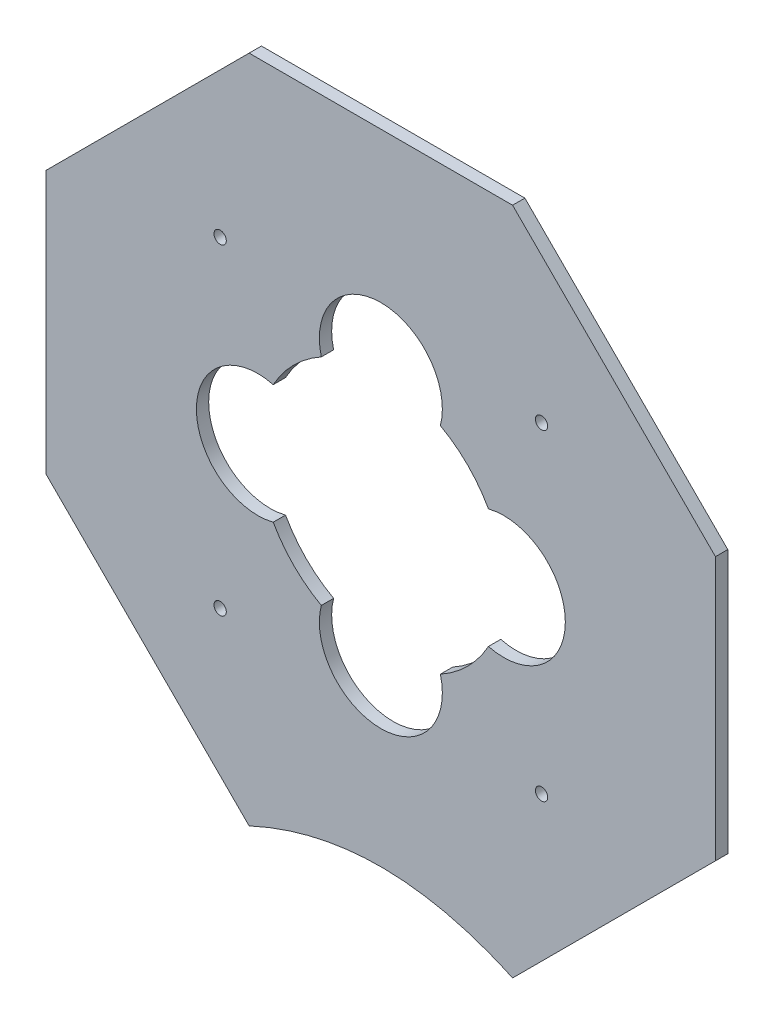
ISO-10303-21;
HEADER;
FILE_DESCRIPTION(('STEP AP214'),'2;1');
FILE_NAME('part.step','',(''),(''),'','','');
FILE_SCHEMA(('AUTOMOTIVE_DESIGN { 1 0 10303 214 1 1 1 1 }'));
ENDSEC;
DATA;
#1=APPLICATION_CONTEXT('core data for automotive mechanical design processes');
#2=APPLICATION_PROTOCOL_DEFINITION('international standard','automotive_design',2000,#1);
#3=PRODUCT_CONTEXT('',#1,'mechanical');
#4=PRODUCT('Part','Part','',(#3));
#5=PRODUCT_RELATED_PRODUCT_CATEGORY('part','',(#4));
#6=PRODUCT_DEFINITION_FORMATION('','',#4);
#7=PRODUCT_DEFINITION_CONTEXT('part definition',#1,'design');
#8=PRODUCT_DEFINITION('design','',#6,#7);
#9=PRODUCT_DEFINITION_SHAPE('','',#8);
#10=(LENGTH_UNIT() NAMED_UNIT(*) SI_UNIT(.MILLI.,.METRE.));
#11=(NAMED_UNIT(*) PLANE_ANGLE_UNIT() SI_UNIT($,.RADIAN.));
#12=(NAMED_UNIT(*) SI_UNIT($,.STERADIAN.) SOLID_ANGLE_UNIT());
#13=UNCERTAINTY_MEASURE_WITH_UNIT(LENGTH_MEASURE(1.E-05),#10,'distance_accuracy_value','');
#14=(GEOMETRIC_REPRESENTATION_CONTEXT(3) GLOBAL_UNCERTAINTY_ASSIGNED_CONTEXT((#13)) GLOBAL_UNIT_ASSIGNED_CONTEXT((#10,
#11,#12)) REPRESENTATION_CONTEXT('',''));
#15=CARTESIAN_POINT('',(0.,0.,0.));
#16=DIRECTION('',(0.,0.,1.));
#17=DIRECTION('',(1.,0.,0.));
#18=AXIS2_PLACEMENT_3D('',#15,#16,#17);
#19=CARTESIAN_POINT('',(-81.6309432949496,32.1334686118915,3.));
#20=DIRECTION('',(0.707106781186547,-0.707106781186547,0.));
#21=DIRECTION('',(0.707106781186548,0.707106781186548,0.));
#22=AXIS2_PLACEMENT_3D('',#19,#20,#21);
#23=PLANE('',#22);
#24=DIRECTION('',(-0.707106781186548,-0.707106781186548,0.));
#25=VECTOR('',#24,1.);
#26=CARTESIAN_POINT('',(-81.6309432949496,32.1334686118915,0.));
#27=LINE('',#26,#25);
#28=CARTESIAN_POINT('',(-32.1334686118913,81.6309432949497,0.));
#29=VERTEX_POINT('',#28);
#30=CARTESIAN_POINT('',(-81.6309432949496,32.1334686118915,0.));
#31=VERTEX_POINT('',#30);
#32=EDGE_CURVE('E229',#29,#31,#27,.T.);
#33=ORIENTED_EDGE('',*,*,#32,.T.);
#34=DIRECTION('',(0.,0.,-1.));
#35=VECTOR('',#34,1.);
#36=CARTESIAN_POINT('',(-81.6309432949496,32.1334686118915,3.));
#37=LINE('',#36,#35);
#38=CARTESIAN_POINT('',(-81.6309432949496,32.1334686118915,3.));
#39=VERTEX_POINT('',#38);
#40=EDGE_CURVE('E11',#39,#31,#37,.T.);
#41=ORIENTED_EDGE('',*,*,#40,.F.);
#42=DIRECTION('',(-0.707106781186548,-0.707106781186548,0.));
#43=VECTOR('',#42,1.);
#44=CARTESIAN_POINT('',(-81.6309432949496,32.1334686118915,3.));
#45=LINE('',#44,#43);
#46=CARTESIAN_POINT('',(-32.1334686118913,81.6309432949497,3.));
#47=VERTEX_POINT('',#46);
#48=EDGE_CURVE('E232',#47,#39,#45,.T.);
#49=ORIENTED_EDGE('',*,*,#48,.F.);
#50=DIRECTION('',(0.,0.,-1.));
#51=VECTOR('',#50,1.);
#52=CARTESIAN_POINT('',(-32.1334686118913,81.6309432949497,3.));
#53=LINE('',#52,#51);
#54=EDGE_CURVE('E301',#47,#29,#53,.T.);
#55=ORIENTED_EDGE('',*,*,#54,.T.);
#56=EDGE_LOOP('',(#33,#41,#49,#55));
#57=FACE_BOUND('',#56,.T.);
#58=ADVANCED_FACE('F37',(#57),#23,.F.);
#59=CARTESIAN_POINT('',(-81.6309432949497,-32.1334686118914,3.));
#60=DIRECTION('',(1.,0.,0.));
#61=DIRECTION('',(0.,1.,0.));
#62=AXIS2_PLACEMENT_3D('',#59,#60,#61);
#63=PLANE('',#62);
#64=DIRECTION('',(0.,-1.,0.));
#65=VECTOR('',#64,1.);
#66=CARTESIAN_POINT('',(-81.6309432949497,-32.1334686118914,0.));
#67=LINE('',#66,#65);
#68=CARTESIAN_POINT('',(-81.6309432949497,-32.1334686118914,0.));
#69=VERTEX_POINT('',#68);
#70=EDGE_CURVE('E269',#31,#69,#67,.T.);
#71=ORIENTED_EDGE('',*,*,#70,.T.);
#72=DIRECTION('',(0.,0.,-1.));
#73=VECTOR('',#72,1.);
#74=CARTESIAN_POINT('',(-81.6309432949497,-32.1334686118914,3.));
#75=LINE('',#74,#73);
#76=CARTESIAN_POINT('',(-81.6309432949497,-32.1334686118914,3.));
#77=VERTEX_POINT('',#76);
#78=EDGE_CURVE('E44',#77,#69,#75,.T.);
#79=ORIENTED_EDGE('',*,*,#78,.F.);
#80=DIRECTION('',(0.,-1.,0.));
#81=VECTOR('',#80,1.);
#82=CARTESIAN_POINT('',(-81.6309432949497,-32.1334686118914,3.));
#83=LINE('',#82,#81);
#84=EDGE_CURVE('E235',#39,#77,#83,.T.);
#85=ORIENTED_EDGE('',*,*,#84,.F.);
#86=ORIENTED_EDGE('',*,*,#40,.T.);
#87=EDGE_LOOP('',(#71,#79,#85,#86));
#88=FACE_BOUND('',#87,.T.);
#89=ADVANCED_FACE('F260',(#88),#63,.F.);
#90=CARTESIAN_POINT('',(-81.6309432949497,-32.1334686118914,3.));
#91=DIRECTION('',(0.707106781186547,0.707106781186548,0.));
#92=DIRECTION('',(-0.707106781186548,0.707106781186547,0.));
#93=AXIS2_PLACEMENT_3D('',#90,#91,#92);
#94=PLANE('',#93);
#95=DIRECTION('',(0.707106781186548,-0.707106781186547,0.));
#96=VECTOR('',#95,1.);
#97=CARTESIAN_POINT('',(-81.6309432949497,-32.1334686118914,0.));
#98=LINE('',#97,#96);
#99=CARTESIAN_POINT('',(-32.1334686118914,-81.6309432949497,0.));
#100=VERTEX_POINT('',#99);
#101=EDGE_CURVE('E277',#69,#100,#98,.T.);
#102=ORIENTED_EDGE('',*,*,#101,.T.);
#103=DIRECTION('',(0.,0.,-1.));
#104=VECTOR('',#103,1.);
#105=CARTESIAN_POINT('',(-32.1334686118914,-81.6309432949497,3.));
#106=LINE('',#105,#104);
#107=CARTESIAN_POINT('',(-32.1334686118914,-81.6309432949497,3.));
#108=VERTEX_POINT('',#107);
#109=EDGE_CURVE('E281',#108,#100,#106,.T.);
#110=ORIENTED_EDGE('',*,*,#109,.F.);
#111=DIRECTION('',(0.707106781186548,-0.707106781186547,0.));
#112=VECTOR('',#111,1.);
#113=CARTESIAN_POINT('',(-81.6309432949497,-32.1334686118914,3.));
#114=LINE('',#113,#112);
#115=EDGE_CURVE('E238',#77,#108,#114,.T.);
#116=ORIENTED_EDGE('',*,*,#115,.F.);
#117=ORIENTED_EDGE('',*,*,#78,.T.);
#118=EDGE_LOOP('',(#102,#110,#116,#117));
#119=FACE_BOUND('',#118,.T.);
#120=ADVANCED_FACE('F256',(#119),#94,.F.);
#121=CARTESIAN_POINT('',(-32.1334686118914,-81.6309432949497,3.));
#122=CARTESIAN_POINT('',(-26.3156049046951,-78.9294696006556,3.));
#123=CARTESIAN_POINT('',(-17.4584669723134,-75.9069292399536,3.));
#124=CARTESIAN_POINT('',(-6.45984668604864,-74.3669710311353,3.));
#125=CARTESIAN_POINT('',(0.503945587693919,-74.0955401463674,3.));
#126=CARTESIAN_POINT('',(13.3814106526898,-74.7374091827583,3.));
#127=CARTESIAN_POINT('',(24.1945271322703,-77.919288078662,3.));
#128=CARTESIAN_POINT('',(32.1334686118914,-81.6309432949497,3.));
#129=B_SPLINE_CURVE_WITH_KNOTS('',3,(#121,#122,#123,#124,#125,#126,#127,#128),.UNSPECIFIED.,.F.,
.F.,(4,1,1,1,1,4),(0.,0.289771887582284,0.418866631486402,0.500125987798941,0.60414879767023,
1.),.UNSPECIFIED.);
#130=DIRECTION('',(0.,0.,-1.));
#131=VECTOR('',#130,1.);
#132=SURFACE_OF_LINEAR_EXTRUSION('',#129,#131);
#133=CARTESIAN_POINT('',(-32.1334686118914,-81.6309432949497,0.));
#134=CARTESIAN_POINT('',(-26.3156049046951,-78.9294696006556,0.));
#135=CARTESIAN_POINT('',(-17.4584669723134,-75.9069292399536,0.));
#136=CARTESIAN_POINT('',(-6.45984668604864,-74.3669710311353,0.));
#137=CARTESIAN_POINT('',(0.503945587693919,-74.0955401463674,0.));
#138=CARTESIAN_POINT('',(13.3814106526898,-74.7374091827583,0.));
#139=CARTESIAN_POINT('',(24.1945271322703,-77.919288078662,0.));
#140=CARTESIAN_POINT('',(32.1334686118914,-81.6309432949497,0.));
#141=B_SPLINE_CURVE_WITH_KNOTS('',3,(#133,#134,#135,#136,#137,#138,#139,#140),.UNSPECIFIED.,.F.,
.F.,(4,1,1,1,1,4),(0.,0.289771887582284,0.418866631486402,0.500125987798941,0.60414879767023,
1.),.UNSPECIFIED.);
#142=CARTESIAN_POINT('',(32.1334686118914,-81.6309432949497,0.));
#143=VERTEX_POINT('',#142);
#144=EDGE_CURVE('E284',#100,#143,#141,.T.);
#145=ORIENTED_EDGE('',*,*,#144,.T.);
#146=DIRECTION('',(0.,0.,-1.));
#147=VECTOR('',#146,1.);
#148=CARTESIAN_POINT('',(32.1334686118914,-81.6309432949497,3.));
#149=LINE('',#148,#147);
#150=CARTESIAN_POINT('',(32.1334686118914,-81.6309432949497,3.));
#151=VERTEX_POINT('',#150);
#152=EDGE_CURVE('E314',#151,#143,#149,.T.);
#153=ORIENTED_EDGE('',*,*,#152,.F.);
#154=EDGE_CURVE('E240',#108,#151,#129,.T.);
#155=ORIENTED_EDGE('',*,*,#154,.F.);
#156=ORIENTED_EDGE('',*,*,#109,.T.);
#157=EDGE_LOOP('',(#145,#153,#155,#156));
#158=FACE_BOUND('',#157,.T.);
#159=ADVANCED_FACE('F251',(#158),#132,.F.);
#160=CARTESIAN_POINT('',(81.6309432949497,-32.1334686118913,3.));
#161=DIRECTION('',(-0.707106781186547,0.707106781186548,0.));
#162=DIRECTION('',(-0.707106781186548,-0.707106781186547,0.));
#163=AXIS2_PLACEMENT_3D('',#160,#161,#162);
#164=PLANE('',#163);
#165=DIRECTION('',(0.707106781186548,0.707106781186548,0.));
#166=VECTOR('',#165,1.);
#167=CARTESIAN_POINT('',(81.6309432949497,-32.1334686118913,0.));
#168=LINE('',#167,#166);
#169=CARTESIAN_POINT('',(81.6309432949497,-32.1334686118913,0.));
#170=VERTEX_POINT('',#169);
#171=EDGE_CURVE('E286',#143,#170,#168,.T.);
#172=ORIENTED_EDGE('',*,*,#171,.T.);
#173=DIRECTION('',(0.,0.,-1.));
#174=VECTOR('',#173,1.);
#175=CARTESIAN_POINT('',(81.6309432949497,-32.1334686118913,3.));
#176=LINE('',#175,#174);
#177=CARTESIAN_POINT('',(81.6309432949497,-32.1334686118913,3.));
#178=VERTEX_POINT('',#177);
#179=EDGE_CURVE('E311',#178,#170,#176,.T.);
#180=ORIENTED_EDGE('',*,*,#179,.F.);
#181=DIRECTION('',(0.707106781186548,0.707106781186548,0.));
#182=VECTOR('',#181,1.);
#183=CARTESIAN_POINT('',(81.6309432949497,-32.1334686118913,3.));
#184=LINE('',#183,#182);
#185=EDGE_CURVE('E245',#151,#178,#184,.T.);
#186=ORIENTED_EDGE('',*,*,#185,.F.);
#187=ORIENTED_EDGE('',*,*,#152,.T.);
#188=EDGE_LOOP('',(#172,#180,#186,#187));
#189=FACE_BOUND('',#188,.T.);
#190=ADVANCED_FACE('F255',(#189),#164,.F.);
#191=CARTESIAN_POINT('',(81.6309432949495,32.1334686118916,3.));
#192=DIRECTION('',(-1.,0.,0.));
#193=DIRECTION('',(0.,-1.,0.));
#194=AXIS2_PLACEMENT_3D('',#191,#192,#193);
#195=PLANE('',#194);
#196=DIRECTION('',(0.,1.,0.));
#197=VECTOR('',#196,1.);
#198=CARTESIAN_POINT('',(81.6309432949495,32.1334686118916,0.));
#199=LINE('',#198,#197);
#200=CARTESIAN_POINT('',(81.6309432949495,32.1334686118916,0.));
#201=VERTEX_POINT('',#200);
#202=EDGE_CURVE('E296',#170,#201,#199,.T.);
#203=ORIENTED_EDGE('',*,*,#202,.T.);
#204=DIRECTION('',(0.,0.,-1.));
#205=VECTOR('',#204,1.);
#206=CARTESIAN_POINT('',(81.6309432949495,32.1334686118916,3.));
#207=LINE('',#206,#205);
#208=CARTESIAN_POINT('',(81.6309432949495,32.1334686118916,3.));
#209=VERTEX_POINT('',#208);
#210=EDGE_CURVE('E308',#209,#201,#207,.T.);
#211=ORIENTED_EDGE('',*,*,#210,.F.);
#212=DIRECTION('',(0.,1.,0.));
#213=VECTOR('',#212,1.);
#214=CARTESIAN_POINT('',(81.6309432949495,32.1334686118916,3.));
#215=LINE('',#214,#213);
#216=EDGE_CURVE('E330',#178,#209,#215,.T.);
#217=ORIENTED_EDGE('',*,*,#216,.F.);
#218=ORIENTED_EDGE('',*,*,#179,.T.);
#219=EDGE_LOOP('',(#203,#211,#217,#218));
#220=FACE_BOUND('',#219,.T.);
#221=ADVANCED_FACE('F336',(#220),#195,.F.);
#222=CARTESIAN_POINT('',(32.1334686118912,81.6309432949499,3.));
#223=DIRECTION('',(-0.707106781186547,-0.707106781186548,0.));
#224=DIRECTION('',(0.707106781186548,-0.707106781186547,0.));
#225=AXIS2_PLACEMENT_3D('',#222,#223,#224);
#226=PLANE('',#225);
#227=DIRECTION('',(-0.707106781186548,0.707106781186547,0.));
#228=VECTOR('',#227,1.);
#229=CARTESIAN_POINT('',(32.1334686118912,81.6309432949499,0.));
#230=LINE('',#229,#228);
#231=CARTESIAN_POINT('',(32.1334686118912,81.6309432949499,0.));
#232=VERTEX_POINT('',#231);
#233=EDGE_CURVE('E298',#201,#232,#230,.T.);
#234=ORIENTED_EDGE('',*,*,#233,.T.);
#235=DIRECTION('',(0.,0.,-1.));
#236=VECTOR('',#235,1.);
#237=CARTESIAN_POINT('',(32.1334686118912,81.6309432949499,3.));
#238=LINE('',#237,#236);
#239=CARTESIAN_POINT('',(32.1334686118912,81.6309432949499,3.));
#240=VERTEX_POINT('',#239);
#241=EDGE_CURVE('E304',#240,#232,#238,.T.);
#242=ORIENTED_EDGE('',*,*,#241,.F.);
#243=DIRECTION('',(-0.707106781186548,0.707106781186547,0.));
#244=VECTOR('',#243,1.);
#245=CARTESIAN_POINT('',(32.1334686118912,81.6309432949499,3.));
#246=LINE('',#245,#244);
#247=EDGE_CURVE('E329',#209,#240,#246,.T.);
#248=ORIENTED_EDGE('',*,*,#247,.F.);
#249=ORIENTED_EDGE('',*,*,#210,.T.);
#250=EDGE_LOOP('',(#234,#242,#248,#249));
#251=FACE_BOUND('',#250,.T.);
#252=ADVANCED_FACE('F340',(#251),#226,.F.);
#253=CARTESIAN_POINT('',(-32.1334686118913,81.6309432949497,3.));
#254=DIRECTION('',(0.,-1.,0.));
#255=DIRECTION('',(1.,0.,0.));
#256=AXIS2_PLACEMENT_3D('',#253,#254,#255);
#257=PLANE('',#256);
#258=DIRECTION('',(-1.,0.,0.));
#259=VECTOR('',#258,1.);
#260=CARTESIAN_POINT('',(-32.1334686118913,81.6309432949497,0.));
#261=LINE('',#260,#259);
#262=EDGE_CURVE('E236',#232,#29,#261,.T.);
#263=ORIENTED_EDGE('',*,*,#262,.T.);
#264=ORIENTED_EDGE('',*,*,#54,.F.);
#265=DIRECTION('',(-1.,0.,0.));
#266=VECTOR('',#265,1.);
#267=CARTESIAN_POINT('',(-32.1334686118913,81.6309432949497,3.));
#268=LINE('',#267,#266);
#269=EDGE_CURVE('E305',#240,#47,#268,.T.);
#270=ORIENTED_EDGE('',*,*,#269,.F.);
#271=ORIENTED_EDGE('',*,*,#241,.T.);
#272=EDGE_LOOP('',(#263,#264,#270,#271));
#273=FACE_BOUND('',#272,.T.);
#274=ADVANCED_FACE('F342',(#273),#257,.F.);
#275=CARTESIAN_POINT('',(-0.00837364830301445,-74.1853267775126,3.));
#276=DIRECTION('',(0.,0.,1.));
#277=DIRECTION('',(1.,0.,0.));
#278=AXIS2_PLACEMENT_3D('',#275,#276,#277);
#279=PLANE('',#278);
#280=CARTESIAN_POINT('',(0.,30.,3.));
#281=DIRECTION('',(0.,0.,1.));
#282=DIRECTION('',(1.,0.,0.));
#283=AXIS2_PLACEMENT_3D('',#280,#281,#282);
#284=CIRCLE('',#283,15.);
#285=CARTESIAN_POINT('',(14.5236875482778,26.25,3.));
#286=VERTEX_POINT('',#285);
#287=CARTESIAN_POINT('',(-14.5236875482778,26.25,3.));
#288=VERTEX_POINT('',#287);
#289=EDGE_CURVE('E51',#286,#288,#284,.T.);
#290=ORIENTED_EDGE('',*,*,#289,.F.);
#291=CARTESIAN_POINT('',(0.,0.,3.));
#292=DIRECTION('',(0.,0.,1.));
#293=DIRECTION('',(1.,0.,0.));
#294=AXIS2_PLACEMENT_3D('',#291,#292,#293);
#295=CIRCLE('',#294,30.);
#296=CARTESIAN_POINT('',(26.25,14.5236875482778,3.));
#297=VERTEX_POINT('',#296);
#298=EDGE_CURVE('E169',#297,#286,#295,.T.);
#299=ORIENTED_EDGE('',*,*,#298,.F.);
#300=CARTESIAN_POINT('',(30.,0.,3.));
#301=DIRECTION('',(0.,0.,1.));
#302=DIRECTION('',(1.,0.,0.));
#303=AXIS2_PLACEMENT_3D('',#300,#301,#302);
#304=CIRCLE('',#303,15.);
#305=CARTESIAN_POINT('',(26.25,-14.5236875482778,3.));
#306=VERTEX_POINT('',#305);
#307=EDGE_CURVE('E172',#306,#297,#304,.T.);
#308=ORIENTED_EDGE('',*,*,#307,.F.);
#309=CARTESIAN_POINT('',(14.5236875482778,-26.25,3.));
#310=VERTEX_POINT('',#309);
#311=EDGE_CURVE('E174',#310,#306,#295,.T.);
#312=ORIENTED_EDGE('',*,*,#311,.F.);
#313=CARTESIAN_POINT('',(0.,-30.,3.));
#314=DIRECTION('',(0.,0.,1.));
#315=DIRECTION('',(1.,0.,0.));
#316=AXIS2_PLACEMENT_3D('',#313,#314,#315);
#317=CIRCLE('',#316,15.);
#318=CARTESIAN_POINT('',(-14.5236875482778,-26.25,3.));
#319=VERTEX_POINT('',#318);
#320=EDGE_CURVE('E189',#319,#310,#317,.T.);
#321=ORIENTED_EDGE('',*,*,#320,.F.);
#322=CARTESIAN_POINT('',(-26.25,-14.5236875482778,3.));
#323=VERTEX_POINT('',#322);
#324=EDGE_CURVE('E186',#323,#319,#295,.T.);
#325=ORIENTED_EDGE('',*,*,#324,.F.);
#326=CARTESIAN_POINT('',(-30.,0.,3.));
#327=DIRECTION('',(0.,0.,1.));
#328=DIRECTION('',(1.,0.,0.));
#329=AXIS2_PLACEMENT_3D('',#326,#327,#328);
#330=CIRCLE('',#329,15.);
#331=CARTESIAN_POINT('',(-26.25,14.5236875482778,3.));
#332=VERTEX_POINT('',#331);
#333=EDGE_CURVE('E185',#332,#323,#330,.T.);
#334=ORIENTED_EDGE('',*,*,#333,.F.);
#335=EDGE_CURVE('E175',#288,#332,#295,.T.);
#336=ORIENTED_EDGE('',*,*,#335,.F.);
#337=EDGE_LOOP('',(#290,#299,#308,#312,#321,#325,#334,#336));
#338=FACE_BOUND('',#337,.T.);
#339=CARTESIAN_POINT('',(-39.2045364237568,-39.2045364237568,3.));
#340=DIRECTION('',(0.,0.,1.));
#341=DIRECTION('',(1.,0.,0.));
#342=AXIS2_PLACEMENT_3D('',#339,#340,#341);
#343=CIRCLE('',#342,1.5);
#344=CARTESIAN_POINT('',(-37.7045364237568,-39.2045364237568,3.));
#345=VERTEX_POINT('',#344);
#346=EDGE_CURVE('E221',#345,#345,#343,.T.);
#347=ORIENTED_EDGE('',*,*,#346,.F.);
#348=EDGE_LOOP('',(#347));
#349=FACE_BOUND('',#348,.T.);
#350=CARTESIAN_POINT('',(39.2045364237568,-39.2045364237568,3.));
#351=DIRECTION('',(0.,0.,1.));
#352=DIRECTION('',(1.,0.,0.));
#353=AXIS2_PLACEMENT_3D('',#350,#351,#352);
#354=CIRCLE('',#353,1.5);
#355=CARTESIAN_POINT('',(40.7045364237568,-39.2045364237568,3.));
#356=VERTEX_POINT('',#355);
#357=EDGE_CURVE('E215',#356,#356,#354,.T.);
#358=ORIENTED_EDGE('',*,*,#357,.F.);
#359=EDGE_LOOP('',(#358));
#360=FACE_BOUND('',#359,.T.);
#361=CARTESIAN_POINT('',(39.2045364237565,39.2045364237569,3.));
#362=DIRECTION('',(0.,0.,1.));
#363=DIRECTION('',(1.,0.,0.));
#364=AXIS2_PLACEMENT_3D('',#361,#362,#363);
#365=CIRCLE('',#364,1.5);
#366=CARTESIAN_POINT('',(40.7045364237565,39.2045364237569,3.));
#367=VERTEX_POINT('',#366);
#368=EDGE_CURVE('E208',#367,#367,#365,.T.);
#369=ORIENTED_EDGE('',*,*,#368,.F.);
#370=EDGE_LOOP('',(#369));
#371=FACE_BOUND('',#370,.T.);
#372=CARTESIAN_POINT('',(-39.2045364237568,39.2045364237569,3.));
#373=DIRECTION('',(0.,0.,1.));
#374=DIRECTION('',(1.,0.,0.));
#375=AXIS2_PLACEMENT_3D('',#372,#373,#374);
#376=CIRCLE('',#375,1.5);
#377=CARTESIAN_POINT('',(-37.7045364237568,39.2045364237569,3.));
#378=VERTEX_POINT('',#377);
#379=EDGE_CURVE('E211',#378,#378,#376,.T.);
#380=ORIENTED_EDGE('',*,*,#379,.F.);
#381=EDGE_LOOP('',(#380));
#382=FACE_BOUND('',#381,.T.);
#383=ORIENTED_EDGE('',*,*,#48,.T.);
#384=ORIENTED_EDGE('',*,*,#84,.T.);
#385=ORIENTED_EDGE('',*,*,#115,.T.);
#386=ORIENTED_EDGE('',*,*,#154,.T.);
#387=ORIENTED_EDGE('',*,*,#185,.T.);
#388=ORIENTED_EDGE('',*,*,#216,.T.);
#389=ORIENTED_EDGE('',*,*,#247,.T.);
#390=ORIENTED_EDGE('',*,*,#269,.T.);
#391=EDGE_LOOP('',(#383,#384,#385,#386,#387,#388,#389,#390));
#392=FACE_BOUND('',#391,.T.);
#393=ADVANCED_FACE('F321',(#338,#349,#360,#371,#382,#392),#279,.T.);
#394=CARTESIAN_POINT('',(-0.00837364830301445,-74.1853267775126,0.));
#395=DIRECTION('',(0.,0.,1.));
#396=DIRECTION('',(1.,0.,0.));
#397=AXIS2_PLACEMENT_3D('',#394,#395,#396);
#398=PLANE('',#397);
#399=CARTESIAN_POINT('',(0.,0.,0.));
#400=DIRECTION('',(0.,0.,1.));
#401=DIRECTION('',(1.,0.,0.));
#402=AXIS2_PLACEMENT_3D('',#399,#400,#401);
#403=CIRCLE('',#402,30.);
#404=CARTESIAN_POINT('',(26.25,14.5236875482778,0.));
#405=VERTEX_POINT('',#404);
#406=CARTESIAN_POINT('',(14.5236875482778,26.25,0.));
#407=VERTEX_POINT('',#406);
#408=EDGE_CURVE('E157',#405,#407,#403,.T.);
#409=ORIENTED_EDGE('',*,*,#408,.T.);
#410=CARTESIAN_POINT('',(0.,30.,0.));
#411=DIRECTION('',(0.,0.,1.));
#412=DIRECTION('',(1.,0.,0.));
#413=AXIS2_PLACEMENT_3D('',#410,#411,#412);
#414=CIRCLE('',#413,15.);
#415=CARTESIAN_POINT('',(-14.5236875482778,26.25,0.));
#416=VERTEX_POINT('',#415);
#417=EDGE_CURVE('E151',#407,#416,#414,.T.);
#418=ORIENTED_EDGE('',*,*,#417,.T.);
#419=CARTESIAN_POINT('',(-26.25,14.5236875482778,0.));
#420=VERTEX_POINT('',#419);
#421=EDGE_CURVE('E160',#416,#420,#403,.T.);
#422=ORIENTED_EDGE('',*,*,#421,.T.);
#423=CARTESIAN_POINT('',(-30.,0.,0.));
#424=DIRECTION('',(0.,0.,1.));
#425=DIRECTION('',(1.,0.,0.));
#426=AXIS2_PLACEMENT_3D('',#423,#424,#425);
#427=CIRCLE('',#426,15.);
#428=CARTESIAN_POINT('',(-26.25,-14.5236875482778,0.));
#429=VERTEX_POINT('',#428);
#430=EDGE_CURVE('E59',#420,#429,#427,.T.);
#431=ORIENTED_EDGE('',*,*,#430,.T.);
#432=CARTESIAN_POINT('',(-14.5236875482778,-26.25,0.));
#433=VERTEX_POINT('',#432);
#434=EDGE_CURVE('E164',#429,#433,#403,.T.);
#435=ORIENTED_EDGE('',*,*,#434,.T.);
#436=CARTESIAN_POINT('',(0.,-30.,0.));
#437=DIRECTION('',(0.,0.,1.));
#438=DIRECTION('',(1.,0.,0.));
#439=AXIS2_PLACEMENT_3D('',#436,#437,#438);
#440=CIRCLE('',#439,15.);
#441=CARTESIAN_POINT('',(14.5236875482778,-26.25,0.));
#442=VERTEX_POINT('',#441);
#443=EDGE_CURVE('E178',#433,#442,#440,.T.);
#444=ORIENTED_EDGE('',*,*,#443,.T.);
#445=CARTESIAN_POINT('',(26.25,-14.5236875482778,0.));
#446=VERTEX_POINT('',#445);
#447=EDGE_CURVE('E181',#442,#446,#403,.T.);
#448=ORIENTED_EDGE('',*,*,#447,.T.);
#449=CARTESIAN_POINT('',(30.,0.,0.));
#450=DIRECTION('',(0.,0.,1.));
#451=DIRECTION('',(1.,0.,0.));
#452=AXIS2_PLACEMENT_3D('',#449,#450,#451);
#453=CIRCLE('',#452,15.);
#454=EDGE_CURVE('E182',#446,#405,#453,.T.);
#455=ORIENTED_EDGE('',*,*,#454,.T.);
#456=EDGE_LOOP('',(#409,#418,#422,#431,#435,#444,#448,#455));
#457=FACE_BOUND('',#456,.T.);
#458=CARTESIAN_POINT('',(-39.2045364237568,-39.2045364237568,0.));
#459=DIRECTION('',(0.,0.,1.));
#460=DIRECTION('',(1.,0.,0.));
#461=AXIS2_PLACEMENT_3D('',#458,#459,#460);
#462=CIRCLE('',#461,1.5);
#463=CARTESIAN_POINT('',(-37.7045364237568,-39.2045364237568,0.));
#464=VERTEX_POINT('',#463);
#465=EDGE_CURVE('E196',#464,#464,#462,.T.);
#466=ORIENTED_EDGE('',*,*,#465,.T.);
#467=EDGE_LOOP('',(#466));
#468=FACE_BOUND('',#467,.T.);
#469=CARTESIAN_POINT('',(39.2045364237568,-39.2045364237568,0.));
#470=DIRECTION('',(0.,0.,1.));
#471=DIRECTION('',(1.,0.,0.));
#472=AXIS2_PLACEMENT_3D('',#469,#470,#471);
#473=CIRCLE('',#472,1.5);
#474=CARTESIAN_POINT('',(40.7045364237568,-39.2045364237568,0.));
#475=VERTEX_POINT('',#474);
#476=EDGE_CURVE('E218',#475,#475,#473,.T.);
#477=ORIENTED_EDGE('',*,*,#476,.T.);
#478=EDGE_LOOP('',(#477));
#479=FACE_BOUND('',#478,.T.);
#480=CARTESIAN_POINT('',(39.2045364237565,39.2045364237569,0.));
#481=DIRECTION('',(0.,0.,1.));
#482=DIRECTION('',(1.,0.,0.));
#483=AXIS2_PLACEMENT_3D('',#480,#481,#482);
#484=CIRCLE('',#483,1.5);
#485=CARTESIAN_POINT('',(40.7045364237565,39.2045364237569,0.));
#486=VERTEX_POINT('',#485);
#487=EDGE_CURVE('E212',#486,#486,#484,.T.);
#488=ORIENTED_EDGE('',*,*,#487,.T.);
#489=EDGE_LOOP('',(#488));
#490=FACE_BOUND('',#489,.T.);
#491=CARTESIAN_POINT('',(-39.2045364237568,39.2045364237569,0.));
#492=DIRECTION('',(0.,0.,1.));
#493=DIRECTION('',(1.,0.,0.));
#494=AXIS2_PLACEMENT_3D('',#491,#492,#493);
#495=CIRCLE('',#494,1.5);
#496=CARTESIAN_POINT('',(-37.7045364237568,39.2045364237569,0.));
#497=VERTEX_POINT('',#496);
#498=EDGE_CURVE('E226',#497,#497,#495,.T.);
#499=ORIENTED_EDGE('',*,*,#498,.T.);
#500=EDGE_LOOP('',(#499));
#501=FACE_BOUND('',#500,.T.);
#502=ORIENTED_EDGE('',*,*,#32,.F.);
#503=ORIENTED_EDGE('',*,*,#262,.F.);
#504=ORIENTED_EDGE('',*,*,#233,.F.);
#505=ORIENTED_EDGE('',*,*,#202,.F.);
#506=ORIENTED_EDGE('',*,*,#171,.F.);
#507=ORIENTED_EDGE('',*,*,#144,.F.);
#508=ORIENTED_EDGE('',*,*,#101,.F.);
#509=ORIENTED_EDGE('',*,*,#70,.F.);
#510=EDGE_LOOP('',(#502,#503,#504,#505,#506,#507,#508,#509));
#511=FACE_BOUND('',#510,.T.);
#512=ADVANCED_FACE('F165',(#457,#468,#479,#490,#501,#511),#398,.F.);
#513=CARTESIAN_POINT('',(-39.2045364237568,39.2045364237569,0.));
#514=DIRECTION('',(0.,0.,1.));
#515=DIRECTION('',(1.,0.,0.));
#516=AXIS2_PLACEMENT_3D('',#513,#514,#515);
#517=CYLINDRICAL_SURFACE('',#516,1.5);
#518=ORIENTED_EDGE('',*,*,#498,.F.);
#519=EDGE_LOOP('',(#518));
#520=FACE_BOUND('',#519,.T.);
#521=ORIENTED_EDGE('',*,*,#379,.T.);
#522=EDGE_LOOP('',(#521));
#523=FACE_BOUND('',#522,.T.);
#524=ADVANCED_FACE('F357',(#520,#523),#517,.F.);
#525=CARTESIAN_POINT('',(39.2045364237565,39.2045364237569,0.));
#526=DIRECTION('',(0.,0.,1.));
#527=DIRECTION('',(1.,0.,0.));
#528=AXIS2_PLACEMENT_3D('',#525,#526,#527);
#529=CYLINDRICAL_SURFACE('',#528,1.5);
#530=ORIENTED_EDGE('',*,*,#487,.F.);
#531=EDGE_LOOP('',(#530));
#532=FACE_BOUND('',#531,.T.);
#533=ORIENTED_EDGE('',*,*,#368,.T.);
#534=EDGE_LOOP('',(#533));
#535=FACE_BOUND('',#534,.T.);
#536=ADVANCED_FACE('F363',(#532,#535),#529,.F.);
#537=CARTESIAN_POINT('',(39.2045364237568,-39.2045364237568,0.));
#538=DIRECTION('',(0.,0.,1.));
#539=DIRECTION('',(1.,0.,0.));
#540=AXIS2_PLACEMENT_3D('',#537,#538,#539);
#541=CYLINDRICAL_SURFACE('',#540,1.5);
#542=ORIENTED_EDGE('',*,*,#476,.F.);
#543=EDGE_LOOP('',(#542));
#544=FACE_BOUND('',#543,.T.);
#545=ORIENTED_EDGE('',*,*,#357,.T.);
#546=EDGE_LOOP('',(#545));
#547=FACE_BOUND('',#546,.T.);
#548=ADVANCED_FACE('F368',(#544,#547),#541,.F.);
#549=CARTESIAN_POINT('',(-39.2045364237568,-39.2045364237568,0.));
#550=DIRECTION('',(0.,0.,1.));
#551=DIRECTION('',(1.,0.,0.));
#552=AXIS2_PLACEMENT_3D('',#549,#550,#551);
#553=CYLINDRICAL_SURFACE('',#552,1.5);
#554=ORIENTED_EDGE('',*,*,#465,.F.);
#555=EDGE_LOOP('',(#554));
#556=FACE_BOUND('',#555,.T.);
#557=ORIENTED_EDGE('',*,*,#346,.T.);
#558=EDGE_LOOP('',(#557));
#559=FACE_BOUND('',#558,.T.);
#560=ADVANCED_FACE('F365',(#556,#559),#553,.F.);
#561=CARTESIAN_POINT('',(0.,30.,0.));
#562=DIRECTION('',(0.,0.,1.));
#563=DIRECTION('',(1.,0.,0.));
#564=AXIS2_PLACEMENT_3D('',#561,#562,#563);
#565=CYLINDRICAL_SURFACE('',#564,15.);
#566=ORIENTED_EDGE('',*,*,#289,.T.);
#567=DIRECTION('',(0.,0.,1.));
#568=VECTOR('',#567,1.);
#569=CARTESIAN_POINT('',(-14.5236875482778,26.25,0.));
#570=LINE('',#569,#568);
#571=EDGE_CURVE('E147',#416,#288,#570,.T.);
#572=ORIENTED_EDGE('',*,*,#571,.F.);
#573=ORIENTED_EDGE('',*,*,#417,.F.);
#574=DIRECTION('',(0.,0.,1.));
#575=VECTOR('',#574,1.);
#576=CARTESIAN_POINT('',(14.5236875482778,26.25,0.));
#577=LINE('',#576,#575);
#578=EDGE_CURVE('E194',#407,#286,#577,.T.);
#579=ORIENTED_EDGE('',*,*,#578,.T.);
#580=EDGE_LOOP('',(#566,#572,#573,#579));
#581=FACE_BOUND('',#580,.T.);
#582=ADVANCED_FACE('F149',(#581),#565,.F.);
#583=CARTESIAN_POINT('',(0.,0.,0.));
#584=DIRECTION('',(0.,0.,1.));
#585=DIRECTION('',(1.,0.,0.));
#586=AXIS2_PLACEMENT_3D('',#583,#584,#585);
#587=CYLINDRICAL_SURFACE('',#586,30.);
#588=ORIENTED_EDGE('',*,*,#298,.T.);
#589=ORIENTED_EDGE('',*,*,#578,.F.);
#590=ORIENTED_EDGE('',*,*,#408,.F.);
#591=DIRECTION('',(0.,0.,1.));
#592=VECTOR('',#591,1.);
#593=CARTESIAN_POINT('',(26.25,14.5236875482778,0.));
#594=LINE('',#593,#592);
#595=EDGE_CURVE('E197',#405,#297,#594,.T.);
#596=ORIENTED_EDGE('',*,*,#595,.T.);
#597=EDGE_LOOP('',(#588,#589,#590,#596));
#598=FACE_BOUND('',#597,.T.);
#599=ADVANCED_FACE('F378',(#598),#587,.F.);
#600=CARTESIAN_POINT('',(30.,0.,0.));
#601=DIRECTION('',(0.,0.,1.));
#602=DIRECTION('',(1.,0.,0.));
#603=AXIS2_PLACEMENT_3D('',#600,#601,#602);
#604=CYLINDRICAL_SURFACE('',#603,15.);
#605=ORIENTED_EDGE('',*,*,#307,.T.);
#606=ORIENTED_EDGE('',*,*,#595,.F.);
#607=ORIENTED_EDGE('',*,*,#454,.F.);
#608=DIRECTION('',(0.,0.,1.));
#609=VECTOR('',#608,1.);
#610=CARTESIAN_POINT('',(26.25,-14.5236875482778,0.));
#611=LINE('',#610,#609);
#612=EDGE_CURVE('E199',#446,#306,#611,.T.);
#613=ORIENTED_EDGE('',*,*,#612,.T.);
#614=EDGE_LOOP('',(#605,#606,#607,#613));
#615=FACE_BOUND('',#614,.T.);
#616=ADVANCED_FACE('F388',(#615),#604,.F.);
#617=ORIENTED_EDGE('',*,*,#311,.T.);
#618=ORIENTED_EDGE('',*,*,#612,.F.);
#619=ORIENTED_EDGE('',*,*,#447,.F.);
#620=DIRECTION('',(0.,0.,1.));
#621=VECTOR('',#620,1.);
#622=CARTESIAN_POINT('',(14.5236875482778,-26.25,0.));
#623=LINE('',#622,#621);
#624=EDGE_CURVE('E201',#442,#310,#623,.T.);
#625=ORIENTED_EDGE('',*,*,#624,.T.);
#626=EDGE_LOOP('',(#617,#618,#619,#625));
#627=FACE_BOUND('',#626,.T.);
#628=ADVANCED_FACE('F386',(#627),#587,.F.);
#629=CARTESIAN_POINT('',(0.,-30.,0.));
#630=DIRECTION('',(0.,0.,1.));
#631=DIRECTION('',(1.,0.,0.));
#632=AXIS2_PLACEMENT_3D('',#629,#630,#631);
#633=CYLINDRICAL_SURFACE('',#632,15.);
#634=ORIENTED_EDGE('',*,*,#320,.T.);
#635=ORIENTED_EDGE('',*,*,#624,.F.);
#636=ORIENTED_EDGE('',*,*,#443,.F.);
#637=DIRECTION('',(0.,0.,1.));
#638=VECTOR('',#637,1.);
#639=CARTESIAN_POINT('',(-14.5236875482778,-26.25,0.));
#640=LINE('',#639,#638);
#641=EDGE_CURVE('E203',#433,#319,#640,.T.);
#642=ORIENTED_EDGE('',*,*,#641,.T.);
#643=EDGE_LOOP('',(#634,#635,#636,#642));
#644=FACE_BOUND('',#643,.T.);
#645=ADVANCED_FACE('F383',(#644),#633,.F.);
#646=ORIENTED_EDGE('',*,*,#324,.T.);
#647=ORIENTED_EDGE('',*,*,#641,.F.);
#648=ORIENTED_EDGE('',*,*,#434,.F.);
#649=DIRECTION('',(0.,0.,1.));
#650=VECTOR('',#649,1.);
#651=CARTESIAN_POINT('',(-26.25,-14.5236875482778,0.));
#652=LINE('',#651,#650);
#653=EDGE_CURVE('E205',#429,#323,#652,.T.);
#654=ORIENTED_EDGE('',*,*,#653,.T.);
#655=EDGE_LOOP('',(#646,#647,#648,#654));
#656=FACE_BOUND('',#655,.T.);
#657=ADVANCED_FACE('F382',(#656),#587,.F.);
#658=CARTESIAN_POINT('',(-30.,0.,0.));
#659=DIRECTION('',(0.,0.,1.));
#660=DIRECTION('',(1.,0.,0.));
#661=AXIS2_PLACEMENT_3D('',#658,#659,#660);
#662=CYLINDRICAL_SURFACE('',#661,15.);
#663=ORIENTED_EDGE('',*,*,#333,.T.);
#664=ORIENTED_EDGE('',*,*,#653,.F.);
#665=ORIENTED_EDGE('',*,*,#430,.F.);
#666=DIRECTION('',(0.,0.,1.));
#667=VECTOR('',#666,1.);
#668=CARTESIAN_POINT('',(-26.25,14.5236875482778,0.));
#669=LINE('',#668,#667);
#670=EDGE_CURVE('E156',#420,#332,#669,.T.);
#671=ORIENTED_EDGE('',*,*,#670,.T.);
#672=EDGE_LOOP('',(#663,#664,#665,#671));
#673=FACE_BOUND('',#672,.T.);
#674=ADVANCED_FACE('F379',(#673),#662,.F.);
#675=ORIENTED_EDGE('',*,*,#335,.T.);
#676=ORIENTED_EDGE('',*,*,#670,.F.);
#677=ORIENTED_EDGE('',*,*,#421,.F.);
#678=ORIENTED_EDGE('',*,*,#571,.T.);
#679=EDGE_LOOP('',(#675,#676,#677,#678));
#680=FACE_BOUND('',#679,.T.);
#681=ADVANCED_FACE('F161',(#680),#587,.F.);
#682=CLOSED_SHELL('',(#58,#89,#120,#159,#190,#221,#252,#274,#393,#512,#524,#536,#548,#560,#582,
#599,#616,#628,#645,#657,#674,#681));
#683=MANIFOLD_SOLID_BREP('B2',#682);
#684=ADVANCED_BREP_SHAPE_REPRESENTATION('',(#18,#683),#14);
#685=SHAPE_DEFINITION_REPRESENTATION(#9,#684);
ENDSEC;
END-ISO-10303-21;
